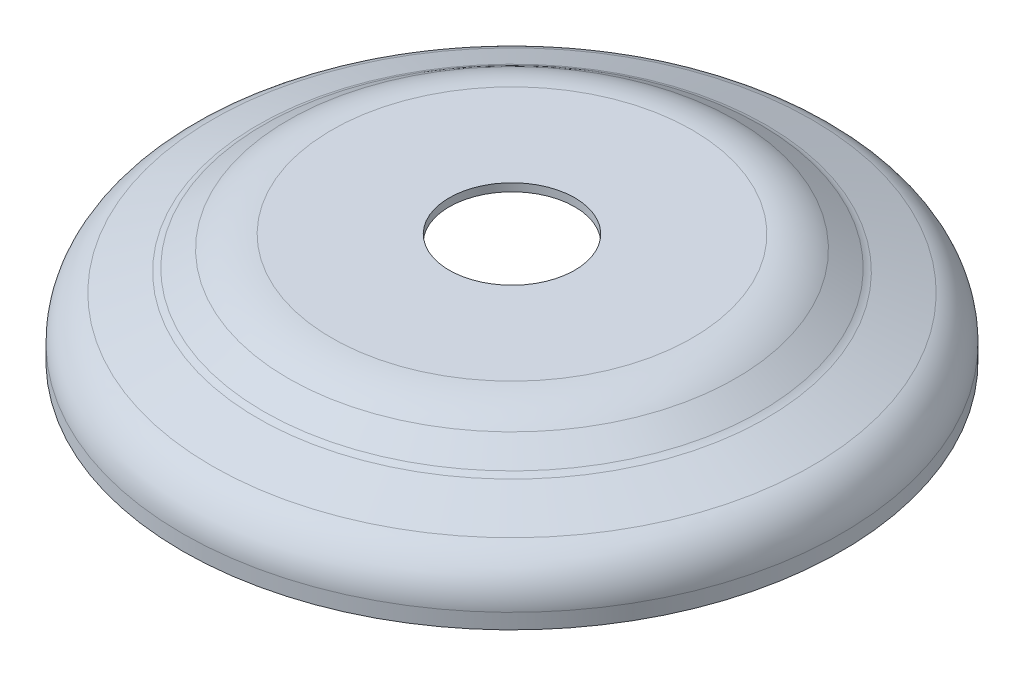
ISO-10303-21;
HEADER;
FILE_DESCRIPTION(('STEP AP214'),'2;1');
FILE_NAME('part.step','',(''),(''),'','','');
FILE_SCHEMA(('AUTOMOTIVE_DESIGN { 1 0 10303 214 1 1 1 1 }'));
ENDSEC;
DATA;
#1=APPLICATION_CONTEXT('core data for automotive mechanical design processes');
#2=APPLICATION_PROTOCOL_DEFINITION('international standard','automotive_design',2000,#1);
#3=PRODUCT_CONTEXT('',#1,'mechanical');
#4=PRODUCT('Part','Part','',(#3));
#5=PRODUCT_RELATED_PRODUCT_CATEGORY('part','',(#4));
#6=PRODUCT_DEFINITION_FORMATION('','',#4);
#7=PRODUCT_DEFINITION_CONTEXT('part definition',#1,'design');
#8=PRODUCT_DEFINITION('design','',#6,#7);
#9=PRODUCT_DEFINITION_SHAPE('','',#8);
#10=(LENGTH_UNIT() NAMED_UNIT(*) SI_UNIT(.MILLI.,.METRE.));
#11=(NAMED_UNIT(*) PLANE_ANGLE_UNIT() SI_UNIT($,.RADIAN.));
#12=(NAMED_UNIT(*) SI_UNIT($,.STERADIAN.) SOLID_ANGLE_UNIT());
#13=UNCERTAINTY_MEASURE_WITH_UNIT(LENGTH_MEASURE(1.E-05),#10,'distance_accuracy_value','');
#14=(GEOMETRIC_REPRESENTATION_CONTEXT(3) GLOBAL_UNCERTAINTY_ASSIGNED_CONTEXT((#13)) GLOBAL_UNIT_ASSIGNED_CONTEXT((#10,
#11,#12)) REPRESENTATION_CONTEXT('',''));
#15=CARTESIAN_POINT('',(0.,0.,0.));
#16=DIRECTION('',(0.,0.,1.));
#17=DIRECTION('',(1.,0.,0.));
#18=AXIS2_PLACEMENT_3D('',#15,#16,#17);
#19=CARTESIAN_POINT('',(0.,2.,0.));
#20=DIRECTION('',(0.,-1.,0.));
#21=DIRECTION('',(0.,0.,-1.));
#22=AXIS2_PLACEMENT_3D('',#19,#20,#21);
#23=TOROIDAL_SURFACE('',#22,11.48612181134,5.);
#24=CARTESIAN_POINT('',(0.,7.,0.));
#25=DIRECTION('',(0.,-1.,0.));
#26=DIRECTION('',(0.,0.,-1.));
#27=AXIS2_PLACEMENT_3D('',#24,#25,#26);
#28=CIRCLE('',#27,11.48612181134);
#29=CARTESIAN_POINT('',(0.,7.,-11.48612181134));
#30=VERTEX_POINT('',#29);
#31=EDGE_CURVE('E82',#30,#30,#28,.T.);
#32=ORIENTED_EDGE('',*,*,#31,.T.);
#33=EDGE_LOOP('',(#32));
#34=FACE_BOUND('',#33,.T.);
#35=CARTESIAN_POINT('',(0.,6.16025147168921,0.));
#36=DIRECTION('',(0.,-1.,0.));
#37=DIRECTION('',(0.,0.,-1.));
#38=AXIS2_PLACEMENT_3D('',#35,#36,#37);
#39=CIRCLE('',#38,14.2596227924662);
#40=CARTESIAN_POINT('',(0.,6.16025147168921,-14.2596227924662));
#41=VERTEX_POINT('',#40);
#42=EDGE_CURVE('E10',#41,#41,#39,.T.);
#43=ORIENTED_EDGE('',*,*,#42,.F.);
#44=EDGE_LOOP('',(#43));
#45=FACE_BOUND('',#44,.T.);
#46=ADVANCED_FACE('F30',(#34,#45),#23,.T.);
#47=CARTESIAN_POINT('',(0.,5.11551294299483,0.));
#48=DIRECTION('',(0.,-1.,0.));
#49=DIRECTION('',(0.,0.,-1.));
#50=AXIS2_PLACEMENT_3D('',#47,#48,#49);
#51=CONICAL_SURFACE('',#50,15.8267305855078,0.98279372324733);
#52=ORIENTED_EDGE('',*,*,#42,.T.);
#53=EDGE_LOOP('',(#52));
#54=FACE_BOUND('',#53,.T.);
#55=CARTESIAN_POINT('',(0.,5.11551294299483,0.));
#56=DIRECTION('',(0.,-1.,0.));
#57=DIRECTION('',(0.,0.,-1.));
#58=AXIS2_PLACEMENT_3D('',#55,#56,#57);
#59=CIRCLE('',#58,15.8267305855078);
#60=CARTESIAN_POINT('',(0.,5.11551294299483,-15.8267305855078));
#61=VERTEX_POINT('',#60);
#62=EDGE_CURVE('E36',#61,#61,#59,.T.);
#63=ORIENTED_EDGE('',*,*,#62,.F.);
#64=EDGE_LOOP('',(#63));
#65=FACE_BOUND('',#64,.T.);
#66=ADVANCED_FACE('F100',(#54,#65),#51,.T.);
#67=CARTESIAN_POINT('',(0.,6.77961353167052,0.));
#68=DIRECTION('',(0.,-1.,0.));
#69=DIRECTION('',(0.,0.,-1.));
#70=AXIS2_PLACEMENT_3D('',#67,#68,#69);
#71=TOROIDAL_SURFACE('',#70,16.9361309779582,2.);
#72=ORIENTED_EDGE('',*,*,#62,.T.);
#73=EDGE_LOOP('',(#72));
#74=FACE_BOUND('',#73,.T.);
#75=CARTESIAN_POINT('',(0.,4.92266014989999,0.));
#76=DIRECTION('',(0.,-1.,0.));
#77=DIRECTION('',(0.,0.,-1.));
#78=AXIS2_PLACEMENT_3D('',#75,#76,#77);
#79=CIRCLE('',#78,16.19334962525);
#80=CARTESIAN_POINT('',(0.,4.92266014989999,-16.19334962525));
#81=VERTEX_POINT('',#80);
#82=EDGE_CURVE('E40',#81,#81,#79,.T.);
#83=ORIENTED_EDGE('',*,*,#82,.F.);
#84=EDGE_LOOP('',(#83));
#85=FACE_BOUND('',#84,.T.);
#86=ADVANCED_FACE('F104',(#74,#85),#71,.F.);
#87=CARTESIAN_POINT('',(0.,3.75433118837508,0.));
#88=DIRECTION('',(0.,-1.,0.));
#89=DIRECTION('',(0.,0.,-1.));
#90=AXIS2_PLACEMENT_3D('',#87,#88,#89);
#91=CONICAL_SURFACE('',#90,19.1141720290623,1.19028994968253);
#92=ORIENTED_EDGE('',*,*,#82,.T.);
#93=EDGE_LOOP('',(#92));
#94=FACE_BOUND('',#93,.T.);
#95=CARTESIAN_POINT('',(0.,3.75433118837508,0.));
#96=DIRECTION('',(0.,-1.,0.));
#97=DIRECTION('',(0.,0.,-1.));
#98=AXIS2_PLACEMENT_3D('',#95,#96,#97);
#99=CIRCLE('',#98,19.1141720290623);
#100=CARTESIAN_POINT('',(0.,3.75433118837508,-19.1141720290623));
#101=VERTEX_POINT('',#100);
#102=EDGE_CURVE('E44',#101,#101,#99,.T.);
#103=ORIENTED_EDGE('',*,*,#102,.F.);
#104=EDGE_LOOP('',(#103));
#105=FACE_BOUND('',#104,.T.);
#106=ADVANCED_FACE('F108',(#94,#105),#91,.T.);
#107=CARTESIAN_POINT('',(0.,0.968901115719298,0.));
#108=DIRECTION('',(0.,-1.,0.));
#109=DIRECTION('',(0.,0.,-1.));
#110=AXIS2_PLACEMENT_3D('',#107,#108,#109);
#111=TOROIDAL_SURFACE('',#110,18.,3.);
#112=ORIENTED_EDGE('',*,*,#102,.T.);
#113=EDGE_LOOP('',(#112));
#114=FACE_BOUND('',#113,.T.);
#115=CARTESIAN_POINT('',(0.,0.968901115719282,0.));
#116=DIRECTION('',(0.,-1.,0.));
#117=DIRECTION('',(0.,0.,-1.));
#118=AXIS2_PLACEMENT_3D('',#115,#116,#117);
#119=CIRCLE('',#118,21.);
#120=CARTESIAN_POINT('',(0.,0.968901115719282,-21.));
#121=VERTEX_POINT('',#120);
#122=EDGE_CURVE('E49',#121,#121,#119,.T.);
#123=ORIENTED_EDGE('',*,*,#122,.F.);
#124=EDGE_LOOP('',(#123));
#125=FACE_BOUND('',#124,.T.);
#126=ADVANCED_FACE('F114',(#114,#125),#111,.T.);
#127=CARTESIAN_POINT('',(0.,0.,0.));
#128=DIRECTION('',(0.,-1.,0.));
#129=DIRECTION('',(0.,0.,-1.));
#130=AXIS2_PLACEMENT_3D('',#127,#128,#129);
#131=CYLINDRICAL_SURFACE('',#130,21.);
#132=ORIENTED_EDGE('',*,*,#122,.T.);
#133=EDGE_LOOP('',(#132));
#134=FACE_BOUND('',#133,.T.);
#135=CARTESIAN_POINT('',(0.,0.,0.));
#136=DIRECTION('',(0.,-1.,0.));
#137=DIRECTION('',(0.,0.,-1.));
#138=AXIS2_PLACEMENT_3D('',#135,#136,#137);
#139=CIRCLE('',#138,21.);
#140=CARTESIAN_POINT('',(0.,0.,-21.));
#141=VERTEX_POINT('',#140);
#142=EDGE_CURVE('E52',#141,#141,#139,.T.);
#143=ORIENTED_EDGE('',*,*,#142,.F.);
#144=EDGE_LOOP('',(#143));
#145=FACE_BOUND('',#144,.T.);
#146=ADVANCED_FACE('F118',(#134,#145),#131,.T.);
#147=CARTESIAN_POINT('',(0.,0.,-21.));
#148=DIRECTION('',(0.,-1.,0.));
#149=DIRECTION('',(0.,0.,-1.));
#150=AXIS2_PLACEMENT_3D('',#147,#148,#149);
#151=PLANE('',#150);
#152=ORIENTED_EDGE('',*,*,#142,.T.);
#153=EDGE_LOOP('',(#152));
#154=FACE_BOUND('',#153,.T.);
#155=CARTESIAN_POINT('',(0.,0.,0.));
#156=DIRECTION('',(0.,-1.,0.));
#157=DIRECTION('',(0.,0.,-1.));
#158=AXIS2_PLACEMENT_3D('',#155,#156,#157);
#159=CIRCLE('',#158,20.5);
#160=CARTESIAN_POINT('',(0.,0.,-20.5));
#161=VERTEX_POINT('',#160);
#162=EDGE_CURVE('E55',#161,#161,#159,.T.);
#163=ORIENTED_EDGE('',*,*,#162,.F.);
#164=EDGE_LOOP('',(#163));
#165=FACE_BOUND('',#164,.T.);
#166=ADVANCED_FACE('F122',(#154,#165),#151,.T.);
#167=CARTESIAN_POINT('',(0.,0.,0.));
#168=DIRECTION('',(0.,-1.,0.));
#169=DIRECTION('',(0.,0.,-1.));
#170=AXIS2_PLACEMENT_3D('',#167,#168,#169);
#171=CYLINDRICAL_SURFACE('',#170,20.5);
#172=ORIENTED_EDGE('',*,*,#162,.T.);
#173=EDGE_LOOP('',(#172));
#174=FACE_BOUND('',#173,.T.);
#175=CARTESIAN_POINT('',(0.,0.968901115719285,0.));
#176=DIRECTION('',(0.,-1.,0.));
#177=DIRECTION('',(0.,0.,-1.));
#178=AXIS2_PLACEMENT_3D('',#175,#176,#177);
#179=CIRCLE('',#178,20.5);
#180=CARTESIAN_POINT('',(0.,0.968901115719285,-20.5));
#181=VERTEX_POINT('',#180);
#182=EDGE_CURVE('E58',#181,#181,#179,.T.);
#183=ORIENTED_EDGE('',*,*,#182,.F.);
#184=EDGE_LOOP('',(#183));
#185=FACE_BOUND('',#184,.T.);
#186=ADVANCED_FACE('F126',(#174,#185),#171,.F.);
#187=CARTESIAN_POINT('',(0.,0.968901115719298,0.));
#188=DIRECTION('',(0.,-1.,0.));
#189=DIRECTION('',(0.,0.,-1.));
#190=AXIS2_PLACEMENT_3D('',#187,#188,#189);
#191=TOROIDAL_SURFACE('',#190,18.,2.5);
#192=ORIENTED_EDGE('',*,*,#182,.T.);
#193=EDGE_LOOP('',(#192));
#194=FACE_BOUND('',#193,.T.);
#195=CARTESIAN_POINT('',(0.,3.29009284293245,0.));
#196=DIRECTION('',(0.,-1.,0.));
#197=DIRECTION('',(0.,0.,-1.));
#198=AXIS2_PLACEMENT_3D('',#195,#196,#197);
#199=CIRCLE('',#198,18.9284766908852);
#200=CARTESIAN_POINT('',(0.,3.29009284293245,-18.9284766908852));
#201=VERTEX_POINT('',#200);
#202=EDGE_CURVE('E61',#201,#201,#199,.T.);
#203=ORIENTED_EDGE('',*,*,#202,.F.);
#204=EDGE_LOOP('',(#203));
#205=FACE_BOUND('',#204,.T.);
#206=ADVANCED_FACE('F130',(#194,#205),#191,.F.);
#207=CARTESIAN_POINT('',(0.,4.45842180445736,0.));
#208=DIRECTION('',(0.,-1.,0.));
#209=DIRECTION('',(0.,0.,-1.));
#210=AXIS2_PLACEMENT_3D('',#207,#208,#209);
#211=CONICAL_SURFACE('',#210,16.007654287073,1.19028994968253);
#212=ORIENTED_EDGE('',*,*,#202,.T.);
#213=EDGE_LOOP('',(#212));
#214=FACE_BOUND('',#213,.T.);
#215=CARTESIAN_POINT('',(0.,4.45842180445736,0.));
#216=DIRECTION('',(0.,-1.,0.));
#217=DIRECTION('',(0.,0.,-1.));
#218=AXIS2_PLACEMENT_3D('',#215,#216,#217);
#219=CIRCLE('',#218,16.007654287073);
#220=CARTESIAN_POINT('',(0.,4.45842180445736,-16.007654287073));
#221=VERTEX_POINT('',#220);
#222=EDGE_CURVE('E64',#221,#221,#219,.T.);
#223=ORIENTED_EDGE('',*,*,#222,.F.);
#224=EDGE_LOOP('',(#223));
#225=FACE_BOUND('',#224,.T.);
#226=ADVANCED_FACE('F134',(#214,#225),#211,.F.);
#227=CARTESIAN_POINT('',(0.,6.77961353167052,0.));
#228=DIRECTION('',(0.,-1.,0.));
#229=DIRECTION('',(0.,0.,-1.));
#230=AXIS2_PLACEMENT_3D('',#227,#228,#229);
#231=TOROIDAL_SURFACE('',#230,16.9361309779582,2.5);
#232=ORIENTED_EDGE('',*,*,#222,.T.);
#233=EDGE_LOOP('',(#232));
#234=FACE_BOUND('',#233,.T.);
#235=CARTESIAN_POINT('',(0.,4.69948779582591,0.));
#236=DIRECTION('',(0.,-1.,0.));
#237=DIRECTION('',(0.,0.,-1.));
#238=AXIS2_PLACEMENT_3D('',#235,#236,#237);
#239=CIRCLE('',#238,15.5493804873951);
#240=CARTESIAN_POINT('',(0.,4.69948779582591,-15.5493804873951));
#241=VERTEX_POINT('',#240);
#242=EDGE_CURVE('E67',#241,#241,#239,.T.);
#243=ORIENTED_EDGE('',*,*,#242,.F.);
#244=EDGE_LOOP('',(#243));
#245=FACE_BOUND('',#244,.T.);
#246=ADVANCED_FACE('F138',(#234,#245),#231,.T.);
#247=CARTESIAN_POINT('',(0.,5.74422632452029,0.));
#248=DIRECTION('',(0.,-1.,0.));
#249=DIRECTION('',(0.,0.,-1.));
#250=AXIS2_PLACEMENT_3D('',#247,#248,#249);
#251=CONICAL_SURFACE('',#250,13.9822726943536,0.982793723247329);
#252=ORIENTED_EDGE('',*,*,#242,.T.);
#253=EDGE_LOOP('',(#252));
#254=FACE_BOUND('',#253,.T.);
#255=CARTESIAN_POINT('',(0.,5.74422632452029,0.));
#256=DIRECTION('',(0.,-1.,0.));
#257=DIRECTION('',(0.,0.,-1.));
#258=AXIS2_PLACEMENT_3D('',#255,#256,#257);
#259=CIRCLE('',#258,13.9822726943536);
#260=CARTESIAN_POINT('',(0.,5.74422632452029,-13.9822726943536));
#261=VERTEX_POINT('',#260);
#262=EDGE_CURVE('E70',#261,#261,#259,.T.);
#263=ORIENTED_EDGE('',*,*,#262,.F.);
#264=EDGE_LOOP('',(#263));
#265=FACE_BOUND('',#264,.T.);
#266=ADVANCED_FACE('F142',(#254,#265),#251,.F.);
#267=CARTESIAN_POINT('',(0.,2.,0.));
#268=DIRECTION('',(0.,-1.,0.));
#269=DIRECTION('',(0.,0.,-1.));
#270=AXIS2_PLACEMENT_3D('',#267,#268,#269);
#271=TOROIDAL_SURFACE('',#270,11.48612181134,4.5);
#272=ORIENTED_EDGE('',*,*,#262,.T.);
#273=EDGE_LOOP('',(#272));
#274=FACE_BOUND('',#273,.T.);
#275=CARTESIAN_POINT('',(0.,6.5,0.));
#276=DIRECTION('',(0.,-1.,0.));
#277=DIRECTION('',(0.,0.,-1.));
#278=AXIS2_PLACEMENT_3D('',#275,#276,#277);
#279=CIRCLE('',#278,11.48612181134);
#280=CARTESIAN_POINT('',(0.,6.5,-11.48612181134));
#281=VERTEX_POINT('',#280);
#282=EDGE_CURVE('E73',#281,#281,#279,.T.);
#283=ORIENTED_EDGE('',*,*,#282,.F.);
#284=EDGE_LOOP('',(#283));
#285=FACE_BOUND('',#284,.T.);
#286=ADVANCED_FACE('F146',(#274,#285),#271,.F.);
#287=CARTESIAN_POINT('',(0.,6.5,-4.));
#288=DIRECTION('',(0.,-1.,0.));
#289=DIRECTION('',(0.,0.,-1.));
#290=AXIS2_PLACEMENT_3D('',#287,#288,#289);
#291=PLANE('',#290);
#292=ORIENTED_EDGE('',*,*,#282,.T.);
#293=EDGE_LOOP('',(#292));
#294=FACE_BOUND('',#293,.T.);
#295=CARTESIAN_POINT('',(0.,6.5,0.));
#296=DIRECTION('',(0.,-1.,0.));
#297=DIRECTION('',(0.,0.,-1.));
#298=AXIS2_PLACEMENT_3D('',#295,#296,#297);
#299=CIRCLE('',#298,4.);
#300=CARTESIAN_POINT('',(0.,6.5,-4.));
#301=VERTEX_POINT('',#300);
#302=EDGE_CURVE('E76',#301,#301,#299,.T.);
#303=ORIENTED_EDGE('',*,*,#302,.F.);
#304=EDGE_LOOP('',(#303));
#305=FACE_BOUND('',#304,.T.);
#306=ADVANCED_FACE('F96',(#294,#305),#291,.T.);
#307=CARTESIAN_POINT('',(0.,0.,0.));
#308=DIRECTION('',(0.,-1.,0.));
#309=DIRECTION('',(0.,0.,-1.));
#310=AXIS2_PLACEMENT_3D('',#307,#308,#309);
#311=CYLINDRICAL_SURFACE('',#310,4.);
#312=ORIENTED_EDGE('',*,*,#302,.T.);
#313=EDGE_LOOP('',(#312));
#314=FACE_BOUND('',#313,.T.);
#315=CARTESIAN_POINT('',(0.,7.,0.));
#316=DIRECTION('',(0.,-1.,0.));
#317=DIRECTION('',(0.,0.,-1.));
#318=AXIS2_PLACEMENT_3D('',#315,#316,#317);
#319=CIRCLE('',#318,4.);
#320=CARTESIAN_POINT('',(0.,7.,-4.));
#321=VERTEX_POINT('',#320);
#322=EDGE_CURVE('E79',#321,#321,#319,.T.);
#323=ORIENTED_EDGE('',*,*,#322,.F.);
#324=EDGE_LOOP('',(#323));
#325=FACE_BOUND('',#324,.T.);
#326=ADVANCED_FACE('F90',(#314,#325),#311,.F.);
#327=CARTESIAN_POINT('',(0.,7.,-4.));
#328=DIRECTION('',(0.,1.,0.));
#329=DIRECTION('',(0.,0.,1.));
#330=AXIS2_PLACEMENT_3D('',#327,#328,#329);
#331=PLANE('',#330);
#332=ORIENTED_EDGE('',*,*,#322,.T.);
#333=EDGE_LOOP('',(#332));
#334=FACE_BOUND('',#333,.T.);
#335=ORIENTED_EDGE('',*,*,#31,.F.);
#336=EDGE_LOOP('',(#335));
#337=FACE_BOUND('',#336,.T.);
#338=ADVANCED_FACE('F88',(#334,#337),#331,.T.);
#339=CLOSED_SHELL('',(#46,#66,#86,#106,#126,#146,#166,#186,#206,#226,#246,#266,#286,#306,#326,#338));
#340=MANIFOLD_SOLID_BREP('B2',#339);
#341=ADVANCED_BREP_SHAPE_REPRESENTATION('',(#18,#340),#14);
#342=SHAPE_DEFINITION_REPRESENTATION(#9,#341);
ENDSEC;
END-ISO-10303-21;
